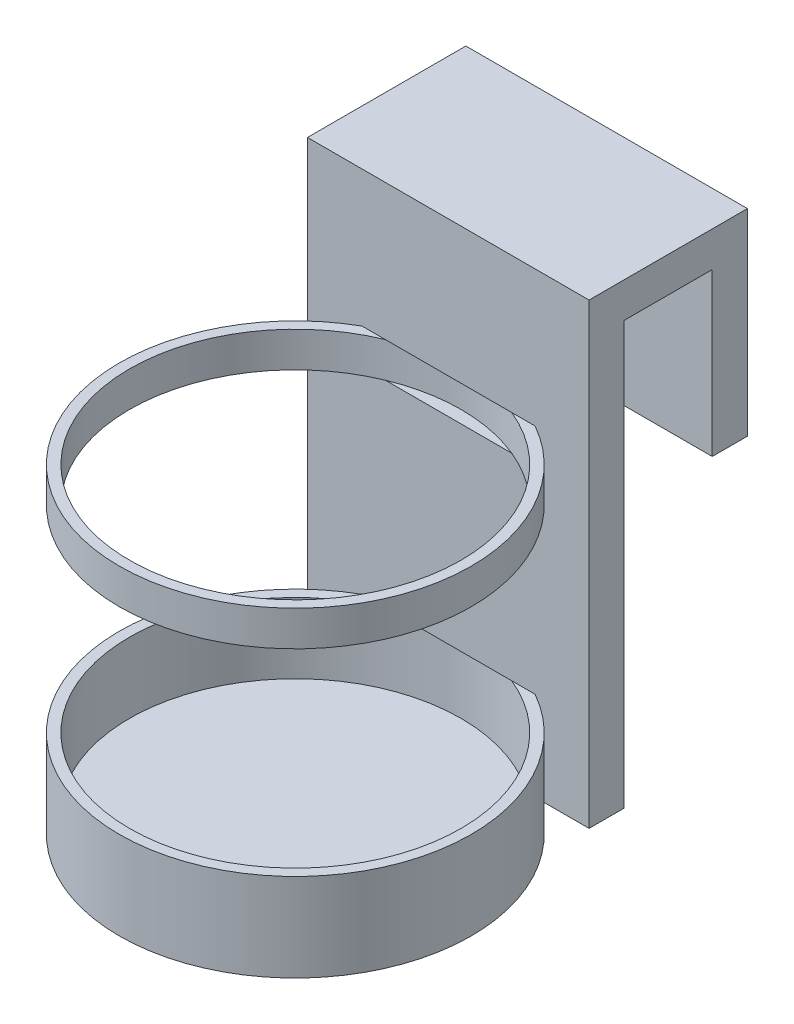
ISO-10303-21;
HEADER;
FILE_DESCRIPTION(('STEP AP214'),'2;1');
FILE_NAME('part.step','',(''),(''),'','','');
FILE_SCHEMA(('AUTOMOTIVE_DESIGN { 1 0 10303 214 1 1 1 1 }'));
ENDSEC;
DATA;
#1=APPLICATION_CONTEXT('core data for automotive mechanical design processes');
#2=APPLICATION_PROTOCOL_DEFINITION('international standard','automotive_design',2000,#1);
#3=PRODUCT_CONTEXT('',#1,'mechanical');
#4=PRODUCT('Part','Part','',(#3));
#5=PRODUCT_RELATED_PRODUCT_CATEGORY('part','',(#4));
#6=PRODUCT_DEFINITION_FORMATION('','',#4);
#7=PRODUCT_DEFINITION_CONTEXT('part definition',#1,'design');
#8=PRODUCT_DEFINITION('design','',#6,#7);
#9=PRODUCT_DEFINITION_SHAPE('','',#8);
#10=(LENGTH_UNIT() NAMED_UNIT(*) SI_UNIT(.MILLI.,.METRE.));
#11=(NAMED_UNIT(*) PLANE_ANGLE_UNIT() SI_UNIT($,.RADIAN.));
#12=(NAMED_UNIT(*) SI_UNIT($,.STERADIAN.) SOLID_ANGLE_UNIT());
#13=UNCERTAINTY_MEASURE_WITH_UNIT(LENGTH_MEASURE(1.E-05),#10,'distance_accuracy_value','');
#14=(GEOMETRIC_REPRESENTATION_CONTEXT(3) GLOBAL_UNCERTAINTY_ASSIGNED_CONTEXT((#13)) GLOBAL_UNIT_ASSIGNED_CONTEXT((#10,
#11,#12)) REPRESENTATION_CONTEXT('',''));
#15=CARTESIAN_POINT('',(0.,0.,0.));
#16=DIRECTION('',(0.,0.,1.));
#17=DIRECTION('',(1.,0.,0.));
#18=AXIS2_PLACEMENT_3D('',#15,#16,#17);
#19=CARTESIAN_POINT('',(80.,22.6585365853659,-30.609756097561));
#20=DIRECTION('',(0.,1.,0.));
#21=DIRECTION('',(0.,0.,1.));
#22=AXIS2_PLACEMENT_3D('',#19,#20,#21);
#23=PLANE('',#22);
#24=DIRECTION('',(0.,0.,-1.));
#25=VECTOR('',#24,1.);
#26=CARTESIAN_POINT('',(0.,22.6585365853659,-30.609756097561));
#27=LINE('',#26,#25);
#28=CARTESIAN_POINT('',(0.,22.6585365853659,-30.609756097561));
#29=VERTEX_POINT('',#28);
#30=CARTESIAN_POINT('',(0.,22.6585365853659,-40.609756097561));
#31=VERTEX_POINT('',#30);
#32=EDGE_CURVE('E221',#29,#31,#27,.T.);
#33=ORIENTED_EDGE('',*,*,#32,.T.);
#34=DIRECTION('',(-1.,0.,0.));
#35=VECTOR('',#34,1.);
#36=CARTESIAN_POINT('',(80.,22.6585365853659,-40.609756097561));
#37=LINE('',#36,#35);
#38=CARTESIAN_POINT('',(80.,22.6585365853659,-40.609756097561));
#39=VERTEX_POINT('',#38);
#40=EDGE_CURVE('E181',#39,#31,#37,.T.);
#41=ORIENTED_EDGE('',*,*,#40,.F.);
#42=DIRECTION('',(0.,0.,-1.));
#43=VECTOR('',#42,1.);
#44=CARTESIAN_POINT('',(80.,22.6585365853659,-30.609756097561));
#45=LINE('',#44,#43);
#46=CARTESIAN_POINT('',(80.,22.6585365853659,-30.609756097561));
#47=VERTEX_POINT('',#46);
#48=EDGE_CURVE('E208',#47,#39,#45,.T.);
#49=ORIENTED_EDGE('',*,*,#48,.F.);
#50=DIRECTION('',(-1.,0.,0.));
#51=VECTOR('',#50,1.);
#52=CARTESIAN_POINT('',(80.,22.6585365853659,-30.609756097561));
#53=LINE('',#52,#51);
#54=EDGE_CURVE('E202',#47,#29,#53,.T.);
#55=ORIENTED_EDGE('',*,*,#54,.T.);
#56=EDGE_LOOP('',(#33,#41,#49,#55));
#57=FACE_BOUND('',#56,.T.);
#58=ADVANCED_FACE('F34',(#57),#23,.F.);
#59=CARTESIAN_POINT('',(80.,22.6585365853659,-40.609756097561));
#60=DIRECTION('',(0.,0.,1.));
#61=DIRECTION('',(1.,0.,0.));
#62=AXIS2_PLACEMENT_3D('',#59,#60,#61);
#63=PLANE('',#62);
#64=DIRECTION('',(0.,1.,0.));
#65=VECTOR('',#64,1.);
#66=CARTESIAN_POINT('',(0.,22.6585365853659,-40.609756097561));
#67=LINE('',#66,#65);
#68=CARTESIAN_POINT('',(0.,78.6585365853659,-40.609756097561));
#69=VERTEX_POINT('',#68);
#70=EDGE_CURVE('E219',#31,#69,#67,.T.);
#71=ORIENTED_EDGE('',*,*,#70,.T.);
#72=DIRECTION('',(-1.,0.,0.));
#73=VECTOR('',#72,1.);
#74=CARTESIAN_POINT('',(80.,78.6585365853659,-40.609756097561));
#75=LINE('',#74,#73);
#76=CARTESIAN_POINT('',(80.,78.6585365853659,-40.609756097561));
#77=VERTEX_POINT('',#76);
#78=EDGE_CURVE('E184',#77,#69,#75,.T.);
#79=ORIENTED_EDGE('',*,*,#78,.F.);
#80=DIRECTION('',(0.,1.,0.));
#81=VECTOR('',#80,1.);
#82=CARTESIAN_POINT('',(80.,22.6585365853659,-40.609756097561));
#83=LINE('',#82,#81);
#84=EDGE_CURVE('E236',#39,#77,#83,.T.);
#85=ORIENTED_EDGE('',*,*,#84,.F.);
#86=ORIENTED_EDGE('',*,*,#40,.T.);
#87=EDGE_LOOP('',(#71,#79,#85,#86));
#88=FACE_BOUND('',#87,.T.);
#89=ADVANCED_FACE('F271',(#88),#63,.F.);
#90=CARTESIAN_POINT('',(80.,78.6585365853659,-40.609756097561));
#91=DIRECTION('',(0.,-1.,0.));
#92=DIRECTION('',(0.,0.,-1.));
#93=AXIS2_PLACEMENT_3D('',#90,#91,#92);
#94=PLANE('',#93);
#95=DIRECTION('',(0.,0.,1.));
#96=VECTOR('',#95,1.);
#97=CARTESIAN_POINT('',(0.,78.6585365853659,-40.609756097561));
#98=LINE('',#97,#96);
#99=CARTESIAN_POINT('',(0.,78.6585365853658,4.39024390243903));
#100=VERTEX_POINT('',#99);
#101=EDGE_CURVE('E217',#69,#100,#98,.T.);
#102=ORIENTED_EDGE('',*,*,#101,.T.);
#103=DIRECTION('',(-1.,0.,0.));
#104=VECTOR('',#103,1.);
#105=CARTESIAN_POINT('',(80.,78.6585365853658,4.39024390243903));
#106=LINE('',#105,#104);
#107=CARTESIAN_POINT('',(80.,78.6585365853658,4.39024390243903));
#108=VERTEX_POINT('',#107);
#109=EDGE_CURVE('E187',#108,#100,#106,.T.);
#110=ORIENTED_EDGE('',*,*,#109,.F.);
#111=DIRECTION('',(0.,0.,1.));
#112=VECTOR('',#111,1.);
#113=CARTESIAN_POINT('',(80.,78.6585365853659,-40.609756097561));
#114=LINE('',#113,#112);
#115=EDGE_CURVE('E234',#77,#108,#114,.T.);
#116=ORIENTED_EDGE('',*,*,#115,.F.);
#117=ORIENTED_EDGE('',*,*,#78,.T.);
#118=EDGE_LOOP('',(#102,#110,#116,#117));
#119=FACE_BOUND('',#118,.T.);
#120=ADVANCED_FACE('F276',(#119),#94,.F.);
#121=CARTESIAN_POINT('',(80.,78.6585365853658,4.39024390243903));
#122=DIRECTION('',(0.,0.,-1.));
#123=DIRECTION('',(0.,1.,0.));
#124=AXIS2_PLACEMENT_3D('',#121,#122,#123);
#125=PLANE('',#124);
#126=DIRECTION('',(0.,-1.,0.));
#127=VECTOR('',#126,1.);
#128=CARTESIAN_POINT('',(15.5102445220404,-26.,4.39024390243901));
#129=LINE('',#128,#127);
#130=CARTESIAN_POINT('',(15.5102445220404,-26.,4.39024390243901));
#131=VERTEX_POINT('',#130);
#132=CARTESIAN_POINT('',(15.5102445220404,-51.,4.39024390243901));
#133=VERTEX_POINT('',#132);
#134=EDGE_CURVE('E156',#131,#133,#129,.T.);
#135=ORIENTED_EDGE('',*,*,#134,.F.);
#136=DIRECTION('',(1.,0.,0.));
#137=VECTOR('',#136,1.);
#138=CARTESIAN_POINT('',(80.,-26.,4.39024390243902));
#139=LINE('',#138,#137);
#140=CARTESIAN_POINT('',(22.1478720803062,-26.,4.39024390243902));
#141=VERTEX_POINT('',#140);
#142=EDGE_CURVE('E41',#131,#141,#139,.T.);
#143=ORIENTED_EDGE('',*,*,#142,.T.);
#144=CARTESIAN_POINT('',(58.0284553251517,-26.,4.39024390243902));
#145=VERTEX_POINT('',#144);
#146=EDGE_CURVE('E144',#141,#145,#139,.T.);
#147=ORIENTED_EDGE('',*,*,#146,.T.);
#148=CARTESIAN_POINT('',(64.6660828834174,-26.,4.39024390243901));
#149=VERTEX_POINT('',#148);
#150=EDGE_CURVE('E54',#145,#149,#139,.T.);
#151=ORIENTED_EDGE('',*,*,#150,.T.);
#152=DIRECTION('',(0.,-1.,0.));
#153=VECTOR('',#152,1.);
#154=CARTESIAN_POINT('',(64.6660828834174,-26.,4.39024390243901));
#155=LINE('',#154,#153);
#156=CARTESIAN_POINT('',(64.6660828834174,-51.,4.39024390243901));
#157=VERTEX_POINT('',#156);
#158=EDGE_CURVE('E151',#157,#149,#155,.F.);
#159=ORIENTED_EDGE('',*,*,#158,.F.);
#160=DIRECTION('',(1.,0.,0.));
#161=VECTOR('',#160,1.);
#162=CARTESIAN_POINT('',(80.,-51.,4.39024390243902));
#163=LINE('',#162,#161);
#164=EDGE_CURVE('E159',#133,#157,#163,.T.);
#165=ORIENTED_EDGE('',*,*,#164,.F.);
#166=EDGE_LOOP('',(#135,#143,#147,#151,#159,#165));
#167=FACE_BOUND('',#166,.T.);
#168=DIRECTION('',(0.,-1.,0.));
#169=VECTOR('',#168,1.);
#170=CARTESIAN_POINT('',(15.5102445220404,40.,4.39024390243902));
#171=LINE('',#170,#169);
#172=CARTESIAN_POINT('',(15.5102445220404,40.,4.39024390243902));
#173=VERTEX_POINT('',#172);
#174=CARTESIAN_POINT('',(15.5102445220404,30.,4.39024390243903));
#175=VERTEX_POINT('',#174);
#176=EDGE_CURVE('E173',#173,#175,#171,.T.);
#177=ORIENTED_EDGE('',*,*,#176,.F.);
#178=DIRECTION('',(1.,0.,0.));
#179=VECTOR('',#178,1.);
#180=CARTESIAN_POINT('',(80.,40.,4.39024390243903));
#181=LINE('',#180,#179);
#182=CARTESIAN_POINT('',(22.1478720803061,40.,4.39024390243903));
#183=VERTEX_POINT('',#182);
#184=EDGE_CURVE('E165',#173,#183,#181,.T.);
#185=ORIENTED_EDGE('',*,*,#184,.T.);
#186=CARTESIAN_POINT('',(58.0284553251517,40.,4.39024390243903));
#187=VERTEX_POINT('',#186);
#188=EDGE_CURVE('E168',#183,#187,#181,.T.);
#189=ORIENTED_EDGE('',*,*,#188,.T.);
#190=CARTESIAN_POINT('',(64.6660828834174,40.,4.39024390243902));
#191=VERTEX_POINT('',#190);
#192=EDGE_CURVE('E169',#187,#191,#181,.T.);
#193=ORIENTED_EDGE('',*,*,#192,.T.);
#194=DIRECTION('',(0.,-1.,0.));
#195=VECTOR('',#194,1.);
#196=CARTESIAN_POINT('',(64.6660828834174,40.,4.39024390243902));
#197=LINE('',#196,#195);
#198=CARTESIAN_POINT('',(64.6660828834174,30.,4.39024390243903));
#199=VERTEX_POINT('',#198);
#200=EDGE_CURVE('E170',#199,#191,#197,.F.);
#201=ORIENTED_EDGE('',*,*,#200,.F.);
#202=DIRECTION('',(1.,0.,0.));
#203=VECTOR('',#202,1.);
#204=CARTESIAN_POINT('',(80.,30.,4.39024390243903));
#205=LINE('',#204,#203);
#206=CARTESIAN_POINT('',(58.0284553251517,30.,4.39024390243903));
#207=VERTEX_POINT('',#206);
#208=EDGE_CURVE('E180',#207,#199,#205,.T.);
#209=ORIENTED_EDGE('',*,*,#208,.F.);
#210=CARTESIAN_POINT('',(22.1478720803061,30.,4.39024390243903));
#211=VERTEX_POINT('',#210);
#212=EDGE_CURVE('E179',#211,#207,#205,.T.);
#213=ORIENTED_EDGE('',*,*,#212,.F.);
#214=EDGE_CURVE('E176',#175,#211,#205,.T.);
#215=ORIENTED_EDGE('',*,*,#214,.F.);
#216=EDGE_LOOP('',(#177,#185,#189,#193,#201,#209,#213,#215));
#217=FACE_BOUND('',#216,.T.);
#218=DIRECTION('',(0.,-1.,0.));
#219=VECTOR('',#218,1.);
#220=CARTESIAN_POINT('',(0.,78.6585365853658,4.39024390243903));
#221=LINE('',#220,#219);
#222=CARTESIAN_POINT('',(0.,-51.3414634146341,4.39024390243902));
#223=VERTEX_POINT('',#222);
#224=EDGE_CURVE('E215',#100,#223,#221,.T.);
#225=ORIENTED_EDGE('',*,*,#224,.T.);
#226=DIRECTION('',(-1.,0.,0.));
#227=VECTOR('',#226,1.);
#228=CARTESIAN_POINT('',(80.,-51.3414634146341,4.39024390243902));
#229=LINE('',#228,#227);
#230=CARTESIAN_POINT('',(80.,-51.3414634146341,4.39024390243902));
#231=VERTEX_POINT('',#230);
#232=EDGE_CURVE('E190',#231,#223,#229,.T.);
#233=ORIENTED_EDGE('',*,*,#232,.F.);
#234=DIRECTION('',(0.,-1.,0.));
#235=VECTOR('',#234,1.);
#236=CARTESIAN_POINT('',(80.,78.6585365853658,4.39024390243903));
#237=LINE('',#236,#235);
#238=EDGE_CURVE('E232',#108,#231,#237,.T.);
#239=ORIENTED_EDGE('',*,*,#238,.F.);
#240=ORIENTED_EDGE('',*,*,#109,.T.);
#241=EDGE_LOOP('',(#225,#233,#239,#240));
#242=FACE_BOUND('',#241,.T.);
#243=ADVANCED_FACE('F152',(#167,#217,#242),#125,.F.);
#244=CARTESIAN_POINT('',(80.,-51.3414634146341,4.39024390243902));
#245=DIRECTION('',(0.,1.,0.));
#246=DIRECTION('',(0.,0.,1.));
#247=AXIS2_PLACEMENT_3D('',#244,#245,#246);
#248=PLANE('',#247);
#249=DIRECTION('',(0.,0.,-1.));
#250=VECTOR('',#249,1.);
#251=CARTESIAN_POINT('',(0.,-51.3414634146341,4.39024390243902));
#252=LINE('',#251,#250);
#253=CARTESIAN_POINT('',(0.,-51.3414634146341,-5.60975609756098));
#254=VERTEX_POINT('',#253);
#255=EDGE_CURVE('E213',#223,#254,#252,.T.);
#256=ORIENTED_EDGE('',*,*,#255,.T.);
#257=DIRECTION('',(-1.,0.,0.));
#258=VECTOR('',#257,1.);
#259=CARTESIAN_POINT('',(80.,-51.3414634146341,-5.60975609756098));
#260=LINE('',#259,#258);
#261=CARTESIAN_POINT('',(80.,-51.3414634146341,-5.60975609756098));
#262=VERTEX_POINT('',#261);
#263=EDGE_CURVE('E193',#262,#254,#260,.T.);
#264=ORIENTED_EDGE('',*,*,#263,.F.);
#265=DIRECTION('',(0.,0.,-1.));
#266=VECTOR('',#265,1.);
#267=CARTESIAN_POINT('',(80.,-51.3414634146341,4.39024390243902));
#268=LINE('',#267,#266);
#269=EDGE_CURVE('E230',#231,#262,#268,.T.);
#270=ORIENTED_EDGE('',*,*,#269,.F.);
#271=ORIENTED_EDGE('',*,*,#232,.T.);
#272=EDGE_LOOP('',(#256,#264,#270,#271));
#273=FACE_BOUND('',#272,.T.);
#274=ADVANCED_FACE('F308',(#273),#248,.F.);
#275=CARTESIAN_POINT('',(80.,-51.3414634146341,-5.60975609756098));
#276=DIRECTION('',(0.,0.,1.));
#277=DIRECTION('',(1.,0.,0.));
#278=AXIS2_PLACEMENT_3D('',#275,#276,#277);
#279=PLANE('',#278);
#280=DIRECTION('',(0.,1.,0.));
#281=VECTOR('',#280,1.);
#282=CARTESIAN_POINT('',(0.,-51.3414634146341,-5.60975609756098));
#283=LINE('',#282,#281);
#284=CARTESIAN_POINT('',(0.,68.6585365853659,-5.60975609756098));
#285=VERTEX_POINT('',#284);
#286=EDGE_CURVE('E211',#254,#285,#283,.T.);
#287=ORIENTED_EDGE('',*,*,#286,.T.);
#288=DIRECTION('',(-1.,0.,0.));
#289=VECTOR('',#288,1.);
#290=CARTESIAN_POINT('',(80.,68.6585365853659,-5.60975609756098));
#291=LINE('',#290,#289);
#292=CARTESIAN_POINT('',(80.,68.6585365853659,-5.60975609756098));
#293=VERTEX_POINT('',#292);
#294=EDGE_CURVE('E196',#293,#285,#291,.T.);
#295=ORIENTED_EDGE('',*,*,#294,.F.);
#296=DIRECTION('',(0.,1.,0.));
#297=VECTOR('',#296,1.);
#298=CARTESIAN_POINT('',(80.,-51.3414634146341,-5.60975609756098));
#299=LINE('',#298,#297);
#300=EDGE_CURVE('E228',#262,#293,#299,.T.);
#301=ORIENTED_EDGE('',*,*,#300,.F.);
#302=ORIENTED_EDGE('',*,*,#263,.T.);
#303=EDGE_LOOP('',(#287,#295,#301,#302));
#304=FACE_BOUND('',#303,.T.);
#305=ADVANCED_FACE('F303',(#304),#279,.F.);
#306=CARTESIAN_POINT('',(80.,68.6585365853659,-5.60975609756098));
#307=DIRECTION('',(0.,1.,0.));
#308=DIRECTION('',(0.,0.,1.));
#309=AXIS2_PLACEMENT_3D('',#306,#307,#308);
#310=PLANE('',#309);
#311=DIRECTION('',(0.,0.,-1.));
#312=VECTOR('',#311,1.);
#313=CARTESIAN_POINT('',(0.,68.6585365853659,-5.60975609756098));
#314=LINE('',#313,#312);
#315=CARTESIAN_POINT('',(0.,68.6585365853659,-30.609756097561));
#316=VERTEX_POINT('',#315);
#317=EDGE_CURVE('E209',#285,#316,#314,.T.);
#318=ORIENTED_EDGE('',*,*,#317,.T.);
#319=DIRECTION('',(-1.,0.,0.));
#320=VECTOR('',#319,1.);
#321=CARTESIAN_POINT('',(80.,68.6585365853659,-30.609756097561));
#322=LINE('',#321,#320);
#323=CARTESIAN_POINT('',(80.,68.6585365853659,-30.609756097561));
#324=VERTEX_POINT('',#323);
#325=EDGE_CURVE('E199',#324,#316,#322,.T.);
#326=ORIENTED_EDGE('',*,*,#325,.F.);
#327=DIRECTION('',(0.,0.,-1.));
#328=VECTOR('',#327,1.);
#329=CARTESIAN_POINT('',(80.,68.6585365853659,-5.60975609756098));
#330=LINE('',#329,#328);
#331=EDGE_CURVE('E226',#293,#324,#330,.T.);
#332=ORIENTED_EDGE('',*,*,#331,.F.);
#333=ORIENTED_EDGE('',*,*,#294,.T.);
#334=EDGE_LOOP('',(#318,#326,#332,#333));
#335=FACE_BOUND('',#334,.T.);
#336=ADVANCED_FACE('F298',(#335),#310,.F.);
#337=CARTESIAN_POINT('',(80.,68.6585365853659,-30.609756097561));
#338=DIRECTION('',(0.,0.,-1.));
#339=DIRECTION('',(0.,1.,0.));
#340=AXIS2_PLACEMENT_3D('',#337,#338,#339);
#341=PLANE('',#340);
#342=DIRECTION('',(0.,-1.,0.));
#343=VECTOR('',#342,1.);
#344=CARTESIAN_POINT('',(0.,68.6585365853659,-30.609756097561));
#345=LINE('',#344,#343);
#346=EDGE_CURVE('E206',#316,#29,#345,.T.);
#347=ORIENTED_EDGE('',*,*,#346,.T.);
#348=ORIENTED_EDGE('',*,*,#54,.F.);
#349=DIRECTION('',(0.,-1.,0.));
#350=VECTOR('',#349,1.);
#351=CARTESIAN_POINT('',(80.,68.6585365853659,-30.609756097561));
#352=LINE('',#351,#350);
#353=EDGE_CURVE('E205',#324,#47,#352,.T.);
#354=ORIENTED_EDGE('',*,*,#353,.F.);
#355=ORIENTED_EDGE('',*,*,#325,.T.);
#356=EDGE_LOOP('',(#347,#348,#354,#355));
#357=FACE_BOUND('',#356,.T.);
#358=ADVANCED_FACE('F296',(#357),#341,.F.);
#359=CARTESIAN_POINT('',(80.,0.,0.));
#360=DIRECTION('',(1.,0.,0.));
#361=DIRECTION('',(0.,0.,-1.));
#362=AXIS2_PLACEMENT_3D('',#359,#360,#361);
#363=PLANE('',#362);
#364=ORIENTED_EDGE('',*,*,#48,.T.);
#365=ORIENTED_EDGE('',*,*,#84,.T.);
#366=ORIENTED_EDGE('',*,*,#115,.T.);
#367=ORIENTED_EDGE('',*,*,#238,.T.);
#368=ORIENTED_EDGE('',*,*,#269,.T.);
#369=ORIENTED_EDGE('',*,*,#300,.T.);
#370=ORIENTED_EDGE('',*,*,#331,.T.);
#371=ORIENTED_EDGE('',*,*,#353,.T.);
#372=EDGE_LOOP('',(#364,#365,#366,#367,#368,#369,#370,#371));
#373=FACE_BOUND('',#372,.T.);
#374=ADVANCED_FACE('F291',(#373),#363,.T.);
#375=CARTESIAN_POINT('',(0.,0.,0.));
#376=DIRECTION('',(1.,0.,0.));
#377=DIRECTION('',(0.,0.,-1.));
#378=AXIS2_PLACEMENT_3D('',#375,#376,#377);
#379=PLANE('',#378);
#380=ORIENTED_EDGE('',*,*,#32,.F.);
#381=ORIENTED_EDGE('',*,*,#346,.F.);
#382=ORIENTED_EDGE('',*,*,#317,.F.);
#383=ORIENTED_EDGE('',*,*,#286,.F.);
#384=ORIENTED_EDGE('',*,*,#255,.F.);
#385=ORIENTED_EDGE('',*,*,#224,.F.);
#386=ORIENTED_EDGE('',*,*,#101,.F.);
#387=ORIENTED_EDGE('',*,*,#70,.F.);
#388=EDGE_LOOP('',(#380,#381,#382,#383,#384,#385,#386,#387));
#389=FACE_BOUND('',#388,.T.);
#390=ADVANCED_FACE('F284',(#389),#379,.F.);
#391=CARTESIAN_POINT('',(40.0881637027289,40.,47.932474997636));
#392=DIRECTION('',(0.,-1.,0.));
#393=DIRECTION('',(0.,0.,-1.));
#394=AXIS2_PLACEMENT_3D('',#391,#392,#393);
#395=CYLINDRICAL_SURFACE('',#394,50.);
#396=CARTESIAN_POINT('',(40.0881637027289,30.,47.932474997636));
#397=DIRECTION('',(0.,1.,0.));
#398=DIRECTION('',(0.,0.,1.));
#399=AXIS2_PLACEMENT_3D('',#396,#397,#398);
#400=CIRCLE('',#399,50.);
#401=EDGE_CURVE('E240',#175,#199,#400,.T.);
#402=ORIENTED_EDGE('',*,*,#401,.T.);
#403=ORIENTED_EDGE('',*,*,#200,.T.);
#404=CARTESIAN_POINT('',(40.0881637027289,40.,47.932474997636));
#405=DIRECTION('',(0.,1.,0.));
#406=DIRECTION('',(0.,0.,1.));
#407=AXIS2_PLACEMENT_3D('',#404,#405,#406);
#408=CIRCLE('',#407,50.);
#409=EDGE_CURVE('E224',#173,#191,#408,.T.);
#410=ORIENTED_EDGE('',*,*,#409,.F.);
#411=ORIENTED_EDGE('',*,*,#176,.T.);
#412=EDGE_LOOP('',(#402,#403,#410,#411));
#413=FACE_BOUND('',#412,.T.);
#414=ADVANCED_FACE('F331',(#413),#395,.T.);
#415=CARTESIAN_POINT('',(40.0881637027289,40.,47.932474997636));
#416=DIRECTION('',(0.,1.,0.));
#417=DIRECTION('',(0.,0.,1.));
#418=AXIS2_PLACEMENT_3D('',#415,#416,#417);
#419=PLANE('',#418);
#420=CARTESIAN_POINT('',(40.0881637027289,40.,47.932474997636));
#421=DIRECTION('',(0.,1.,0.));
#422=DIRECTION('',(0.,0.,1.));
#423=AXIS2_PLACEMENT_3D('',#420,#421,#422);
#424=CIRCLE('',#423,47.09331112);
#425=EDGE_CURVE('E248',#183,#187,#424,.T.);
#426=ORIENTED_EDGE('',*,*,#425,.F.);
#427=ORIENTED_EDGE('',*,*,#184,.F.);
#428=ORIENTED_EDGE('',*,*,#409,.T.);
#429=ORIENTED_EDGE('',*,*,#192,.F.);
#430=EDGE_LOOP('',(#426,#427,#428,#429));
#431=FACE_BOUND('',#430,.T.);
#432=ADVANCED_FACE('F336',(#431),#419,.T.);
#433=CARTESIAN_POINT('',(40.0881637027289,30.,47.932474997636));
#434=DIRECTION('',(0.,1.,0.));
#435=DIRECTION('',(0.,0.,1.));
#436=AXIS2_PLACEMENT_3D('',#433,#434,#435);
#437=PLANE('',#436);
#438=ORIENTED_EDGE('',*,*,#214,.T.);
#439=CARTESIAN_POINT('',(40.0881637027289,30.,47.932474997636));
#440=DIRECTION('',(0.,1.,0.));
#441=DIRECTION('',(0.,0.,1.));
#442=AXIS2_PLACEMENT_3D('',#439,#440,#441);
#443=CIRCLE('',#442,47.09331112);
#444=EDGE_CURVE('E162',#211,#207,#443,.T.);
#445=ORIENTED_EDGE('',*,*,#444,.T.);
#446=ORIENTED_EDGE('',*,*,#208,.T.);
#447=ORIENTED_EDGE('',*,*,#401,.F.);
#448=EDGE_LOOP('',(#438,#445,#446,#447));
#449=FACE_BOUND('',#448,.T.);
#450=ADVANCED_FACE('F338',(#449),#437,.F.);
#451=CARTESIAN_POINT('',(40.0881637027289,30.,47.932474997636));
#452=DIRECTION('',(0.,1.,0.));
#453=DIRECTION('',(0.,0.,1.));
#454=AXIS2_PLACEMENT_3D('',#451,#452,#453);
#455=PLANE('',#454);
#456=ORIENTED_EDGE('',*,*,#212,.T.);
#457=CARTESIAN_POINT('',(40.0881637027289,30.,47.932474997636));
#458=DIRECTION('',(0.,1.,0.));
#459=DIRECTION('',(0.,0.,1.));
#460=AXIS2_PLACEMENT_3D('',#457,#458,#459);
#461=CIRCLE('',#460,47.09331112);
#462=EDGE_CURVE('E243',#207,#211,#461,.T.);
#463=ORIENTED_EDGE('',*,*,#462,.T.);
#464=EDGE_LOOP('',(#456,#463));
#465=FACE_BOUND('',#464,.T.);
#466=ADVANCED_FACE('F341',(#465),#455,.T.);
#467=CARTESIAN_POINT('',(40.0881637027289,40.,47.932474997636));
#468=DIRECTION('',(0.,1.,0.));
#469=DIRECTION('',(0.,0.,1.));
#470=AXIS2_PLACEMENT_3D('',#467,#468,#469);
#471=PLANE('',#470);
#472=EDGE_CURVE('E246',#187,#183,#424,.T.);
#473=ORIENTED_EDGE('',*,*,#472,.F.);
#474=ORIENTED_EDGE('',*,*,#188,.F.);
#475=EDGE_LOOP('',(#473,#474));
#476=FACE_BOUND('',#475,.T.);
#477=ADVANCED_FACE('F350',(#476),#471,.F.);
#478=CARTESIAN_POINT('',(40.0881637027289,30.,47.932474997636));
#479=DIRECTION('',(0.,1.,0.));
#480=DIRECTION('',(0.,0.,1.));
#481=AXIS2_PLACEMENT_3D('',#478,#479,#480);
#482=CYLINDRICAL_SURFACE('',#481,47.09331112);
#483=ORIENTED_EDGE('',*,*,#462,.F.);
#484=ORIENTED_EDGE('',*,*,#444,.F.);
#485=EDGE_LOOP('',(#483,#484));
#486=FACE_BOUND('',#485,.T.);
#487=ORIENTED_EDGE('',*,*,#472,.T.);
#488=ORIENTED_EDGE('',*,*,#425,.T.);
#489=EDGE_LOOP('',(#487,#488));
#490=FACE_BOUND('',#489,.T.);
#491=ADVANCED_FACE('F346',(#486,#490),#482,.F.);
#492=CARTESIAN_POINT('',(40.0881637027289,-26.,47.932474997636));
#493=DIRECTION('',(0.,-1.,0.));
#494=DIRECTION('',(0.,0.,-1.));
#495=AXIS2_PLACEMENT_3D('',#492,#493,#494);
#496=CYLINDRICAL_SURFACE('',#495,50.);
#497=CARTESIAN_POINT('',(40.0881637027289,-51.,47.932474997636));
#498=DIRECTION('',(0.,1.,0.));
#499=DIRECTION('',(0.,0.,1.));
#500=AXIS2_PLACEMENT_3D('',#497,#498,#499);
#501=CIRCLE('',#500,50.);
#502=EDGE_CURVE('E251',#133,#157,#501,.T.);
#503=ORIENTED_EDGE('',*,*,#502,.T.);
#504=ORIENTED_EDGE('',*,*,#158,.T.);
#505=CARTESIAN_POINT('',(40.0881637027289,-26.,47.932474997636));
#506=DIRECTION('',(0.,1.,0.));
#507=DIRECTION('',(0.,0.,1.));
#508=AXIS2_PLACEMENT_3D('',#505,#506,#507);
#509=CIRCLE('',#508,50.);
#510=EDGE_CURVE('E150',#131,#149,#509,.T.);
#511=ORIENTED_EDGE('',*,*,#510,.F.);
#512=ORIENTED_EDGE('',*,*,#134,.T.);
#513=EDGE_LOOP('',(#503,#504,#511,#512));
#514=FACE_BOUND('',#513,.T.);
#515=ADVANCED_FACE('F349',(#514),#496,.T.);
#516=CARTESIAN_POINT('',(40.0881637027289,-26.,47.932474997636));
#517=DIRECTION('',(0.,1.,0.));
#518=DIRECTION('',(0.,0.,1.));
#519=AXIS2_PLACEMENT_3D('',#516,#517,#518);
#520=PLANE('',#519);
#521=CARTESIAN_POINT('',(40.0881637027289,-26.,47.932474997636));
#522=DIRECTION('',(0.,1.,0.));
#523=DIRECTION('',(0.,0.,1.));
#524=AXIS2_PLACEMENT_3D('',#521,#522,#523);
#525=CIRCLE('',#524,47.09331112);
#526=EDGE_CURVE('E11',#141,#145,#525,.T.);
#527=ORIENTED_EDGE('',*,*,#526,.F.);
#528=ORIENTED_EDGE('',*,*,#142,.F.);
#529=ORIENTED_EDGE('',*,*,#510,.T.);
#530=ORIENTED_EDGE('',*,*,#150,.F.);
#531=EDGE_LOOP('',(#527,#528,#529,#530));
#532=FACE_BOUND('',#531,.T.);
#533=ADVANCED_FACE('F148',(#532),#520,.T.);
#534=CARTESIAN_POINT('',(40.0881637027289,-51.,47.932474997636));
#535=DIRECTION('',(0.,1.,0.));
#536=DIRECTION('',(0.,0.,1.));
#537=AXIS2_PLACEMENT_3D('',#534,#535,#536);
#538=PLANE('',#537);
#539=ORIENTED_EDGE('',*,*,#502,.F.);
#540=ORIENTED_EDGE('',*,*,#164,.T.);
#541=EDGE_LOOP('',(#539,#540));
#542=FACE_BOUND('',#541,.T.);
#543=ADVANCED_FACE('F267',(#542),#538,.F.);
#544=CARTESIAN_POINT('',(40.0881637027289,-26.,47.932474997636));
#545=DIRECTION('',(0.,1.,0.));
#546=DIRECTION('',(0.,0.,1.));
#547=AXIS2_PLACEMENT_3D('',#544,#545,#546);
#548=PLANE('',#547);
#549=CARTESIAN_POINT('',(40.0881637027289,-26.,47.932474997636));
#550=DIRECTION('',(0.,1.,0.));
#551=DIRECTION('',(0.,0.,1.));
#552=AXIS2_PLACEMENT_3D('',#549,#550,#551);
#553=CIRCLE('',#552,47.09331112);
#554=EDGE_CURVE('E46',#145,#141,#553,.T.);
#555=ORIENTED_EDGE('',*,*,#554,.F.);
#556=ORIENTED_EDGE('',*,*,#146,.F.);
#557=EDGE_LOOP('',(#555,#556));
#558=FACE_BOUND('',#557,.T.);
#559=ADVANCED_FACE('F143',(#558),#548,.F.);
#560=CARTESIAN_POINT('',(40.0881637027289,-46.,47.932474997636));
#561=DIRECTION('',(0.,1.,0.));
#562=DIRECTION('',(0.,0.,1.));
#563=AXIS2_PLACEMENT_3D('',#560,#561,#562);
#564=CYLINDRICAL_SURFACE('',#563,47.09331112);
#565=CARTESIAN_POINT('',(40.0881637027289,-46.,47.932474997636));
#566=DIRECTION('',(0.,1.,0.));
#567=DIRECTION('',(0.,0.,1.));
#568=AXIS2_PLACEMENT_3D('',#565,#566,#567);
#569=CIRCLE('',#568,47.09331112);
#570=CARTESIAN_POINT('',(40.0881637027289,-46.,95.025786117636));
#571=VERTEX_POINT('',#570);
#572=EDGE_CURVE('E145',#571,#571,#569,.T.);
#573=ORIENTED_EDGE('',*,*,#572,.F.);
#574=EDGE_LOOP('',(#573));
#575=FACE_BOUND('',#574,.T.);
#576=ORIENTED_EDGE('',*,*,#554,.T.);
#577=ORIENTED_EDGE('',*,*,#526,.T.);
#578=EDGE_LOOP('',(#576,#577));
#579=FACE_BOUND('',#578,.T.);
#580=ADVANCED_FACE('F138',(#575,#579),#564,.F.);
#581=CARTESIAN_POINT('',(40.0881637027289,-46.,47.932474997636));
#582=DIRECTION('',(0.,1.,0.));
#583=DIRECTION('',(0.,0.,1.));
#584=AXIS2_PLACEMENT_3D('',#581,#582,#583);
#585=PLANE('',#584);
#586=ORIENTED_EDGE('',*,*,#572,.T.);
#587=EDGE_LOOP('',(#586));
#588=FACE_BOUND('',#587,.T.);
#589=ADVANCED_FACE('F258',(#588),#585,.T.);
#590=CLOSED_SHELL('',(#58,#89,#120,#243,#274,#305,#336,#358,#374,#390,#414,#432,#450,#466,#477,
#491,#515,#533,#543,#559,#580,#589));
#591=MANIFOLD_SOLID_BREP('B2',#590);
#592=ADVANCED_BREP_SHAPE_REPRESENTATION('',(#18,#591),#14);
#593=SHAPE_DEFINITION_REPRESENTATION(#9,#592);
ENDSEC;
END-ISO-10303-21;
